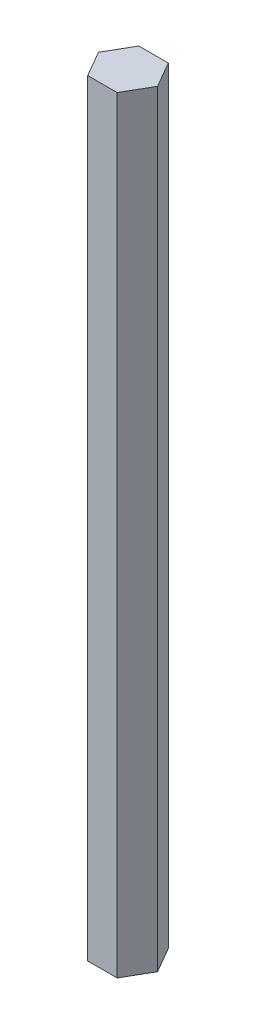
ISO-10303-21;
HEADER;
FILE_DESCRIPTION(('STEP AP214'),'2;1');
FILE_NAME('part.step','',(''),(''),'','','');
FILE_SCHEMA(('AUTOMOTIVE_DESIGN { 1 0 10303 214 1 1 1 1 }'));
ENDSEC;
DATA;
#1=APPLICATION_CONTEXT('core data for automotive mechanical design processes');
#2=APPLICATION_PROTOCOL_DEFINITION('international standard','automotive_design',2000,#1);
#3=PRODUCT_CONTEXT('',#1,'mechanical');
#4=PRODUCT('Part','Part','',(#3));
#5=PRODUCT_RELATED_PRODUCT_CATEGORY('part','',(#4));
#6=PRODUCT_DEFINITION_FORMATION('','',#4);
#7=PRODUCT_DEFINITION_CONTEXT('part definition',#1,'design');
#8=PRODUCT_DEFINITION('design','',#6,#7);
#9=PRODUCT_DEFINITION_SHAPE('','',#8);
#10=(LENGTH_UNIT() NAMED_UNIT(*) SI_UNIT(.MILLI.,.METRE.));
#11=(NAMED_UNIT(*) PLANE_ANGLE_UNIT() SI_UNIT($,.RADIAN.));
#12=(NAMED_UNIT(*) SI_UNIT($,.STERADIAN.) SOLID_ANGLE_UNIT());
#13=UNCERTAINTY_MEASURE_WITH_UNIT(LENGTH_MEASURE(1.E-05),#10,'distance_accuracy_value','');
#14=(GEOMETRIC_REPRESENTATION_CONTEXT(3) GLOBAL_UNCERTAINTY_ASSIGNED_CONTEXT((#13)) GLOBAL_UNIT_ASSIGNED_CONTEXT((#10,
#11,#12)) REPRESENTATION_CONTEXT('',''));
#15=CARTESIAN_POINT('',(0.,0.,0.));
#16=DIRECTION('',(0.,0.,1.));
#17=DIRECTION('',(1.,0.,0.));
#18=AXIS2_PLACEMENT_3D('',#15,#16,#17);
#19=CARTESIAN_POINT('',(-1.44337567297406,75.,2.5));
#20=DIRECTION('',(0.,0.,-1.));
#21=DIRECTION('',(-1.,0.,0.));
#22=AXIS2_PLACEMENT_3D('',#19,#20,#21);
#23=PLANE('',#22);
#24=DIRECTION('',(1.,0.,0.));
#25=VECTOR('',#24,1.);
#26=CARTESIAN_POINT('',(-1.44337567297406,0.,2.5));
#27=LINE('',#26,#25);
#28=CARTESIAN_POINT('',(-1.44337567297406,0.,2.5));
#29=VERTEX_POINT('',#28);
#30=CARTESIAN_POINT('',(1.44337567297406,0.,2.5));
#31=VERTEX_POINT('',#30);
#32=EDGE_CURVE('E116',#29,#31,#27,.T.);
#33=ORIENTED_EDGE('',*,*,#32,.T.);
#34=DIRECTION('',(0.,-1.,0.));
#35=VECTOR('',#34,1.);
#36=CARTESIAN_POINT('',(1.44337567297406,75.,2.5));
#37=LINE('',#36,#35);
#38=CARTESIAN_POINT('',(1.44337567297406,75.,2.5));
#39=VERTEX_POINT('',#38);
#40=EDGE_CURVE('E11',#39,#31,#37,.T.);
#41=ORIENTED_EDGE('',*,*,#40,.F.);
#42=DIRECTION('',(1.,0.,0.));
#43=VECTOR('',#42,1.);
#44=CARTESIAN_POINT('',(-1.44337567297406,75.,2.5));
#45=LINE('',#44,#43);
#46=CARTESIAN_POINT('',(-1.44337567297406,75.,2.5));
#47=VERTEX_POINT('',#46);
#48=EDGE_CURVE('E126',#47,#39,#45,.T.);
#49=ORIENTED_EDGE('',*,*,#48,.F.);
#50=DIRECTION('',(0.,-1.,0.));
#51=VECTOR('',#50,1.);
#52=CARTESIAN_POINT('',(-1.44337567297406,75.,2.5));
#53=LINE('',#52,#51);
#54=EDGE_CURVE('E112',#47,#29,#53,.T.);
#55=ORIENTED_EDGE('',*,*,#54,.T.);
#56=EDGE_LOOP('',(#33,#41,#49,#55));
#57=FACE_BOUND('',#56,.T.);
#58=ADVANCED_FACE('F32',(#57),#23,.F.);
#59=CARTESIAN_POINT('',(1.44337567297406,75.,2.5));
#60=DIRECTION('',(-0.866025403784438,0.,-0.5));
#61=DIRECTION('',(-0.5,0.,0.866025403784439));
#62=AXIS2_PLACEMENT_3D('',#59,#60,#61);
#63=PLANE('',#62);
#64=DIRECTION('',(0.5,0.,-0.866025403784438));
#65=VECTOR('',#64,1.);
#66=CARTESIAN_POINT('',(1.44337567297406,0.,2.5));
#67=LINE('',#66,#65);
#68=CARTESIAN_POINT('',(2.88675134594813,0.,0.));
#69=VERTEX_POINT('',#68);
#70=EDGE_CURVE('E119',#31,#69,#67,.T.);
#71=ORIENTED_EDGE('',*,*,#70,.T.);
#72=DIRECTION('',(0.,-1.,0.));
#73=VECTOR('',#72,1.);
#74=CARTESIAN_POINT('',(2.88675134594813,75.,0.));
#75=LINE('',#74,#73);
#76=CARTESIAN_POINT('',(2.88675134594813,75.,0.));
#77=VERTEX_POINT('',#76);
#78=EDGE_CURVE('E40',#77,#69,#75,.T.);
#79=ORIENTED_EDGE('',*,*,#78,.F.);
#80=DIRECTION('',(0.5,0.,-0.866025403784438));
#81=VECTOR('',#80,1.);
#82=CARTESIAN_POINT('',(1.44337567297406,75.,2.5));
#83=LINE('',#82,#81);
#84=EDGE_CURVE('E85',#39,#77,#83,.T.);
#85=ORIENTED_EDGE('',*,*,#84,.F.);
#86=ORIENTED_EDGE('',*,*,#40,.T.);
#87=EDGE_LOOP('',(#71,#79,#85,#86));
#88=FACE_BOUND('',#87,.T.);
#89=ADVANCED_FACE('F150',(#88),#63,.F.);
#90=CARTESIAN_POINT('',(2.88675134594813,75.,0.));
#91=DIRECTION('',(-0.866025403784438,0.,0.5));
#92=DIRECTION('',(0.5,0.,0.866025403784439));
#93=AXIS2_PLACEMENT_3D('',#90,#91,#92);
#94=PLANE('',#93);
#95=DIRECTION('',(-0.5,0.,-0.866025403784438));
#96=VECTOR('',#95,1.);
#97=CARTESIAN_POINT('',(2.88675134594813,0.,0.));
#98=LINE('',#97,#96);
#99=CARTESIAN_POINT('',(1.44337567297406,0.,-2.5));
#100=VERTEX_POINT('',#99);
#101=EDGE_CURVE('E121',#69,#100,#98,.T.);
#102=ORIENTED_EDGE('',*,*,#101,.T.);
#103=DIRECTION('',(0.,-1.,0.));
#104=VECTOR('',#103,1.);
#105=CARTESIAN_POINT('',(1.44337567297406,75.,-2.5));
#106=LINE('',#105,#104);
#107=CARTESIAN_POINT('',(1.44337567297406,75.,-2.5));
#108=VERTEX_POINT('',#107);
#109=EDGE_CURVE('E107',#108,#100,#106,.T.);
#110=ORIENTED_EDGE('',*,*,#109,.F.);
#111=DIRECTION('',(-0.5,0.,-0.866025403784438));
#112=VECTOR('',#111,1.);
#113=CARTESIAN_POINT('',(2.88675134594813,75.,0.));
#114=LINE('',#113,#112);
#115=EDGE_CURVE('E98',#77,#108,#114,.T.);
#116=ORIENTED_EDGE('',*,*,#115,.F.);
#117=ORIENTED_EDGE('',*,*,#78,.T.);
#118=EDGE_LOOP('',(#102,#110,#116,#117));
#119=FACE_BOUND('',#118,.T.);
#120=ADVANCED_FACE('F132',(#119),#94,.F.);
#121=CARTESIAN_POINT('',(1.44337567297406,75.,-2.5));
#122=DIRECTION('',(0.,0.,1.));
#123=DIRECTION('',(1.,0.,0.));
#124=AXIS2_PLACEMENT_3D('',#121,#122,#123);
#125=PLANE('',#124);
#126=DIRECTION('',(-1.,0.,0.));
#127=VECTOR('',#126,1.);
#128=CARTESIAN_POINT('',(1.44337567297406,0.,-2.5));
#129=LINE('',#128,#127);
#130=CARTESIAN_POINT('',(-1.44337567297406,0.,-2.5));
#131=VERTEX_POINT('',#130);
#132=EDGE_CURVE('E106',#100,#131,#129,.T.);
#133=ORIENTED_EDGE('',*,*,#132,.T.);
#134=DIRECTION('',(0.,-1.,0.));
#135=VECTOR('',#134,1.);
#136=CARTESIAN_POINT('',(-1.44337567297406,75.,-2.5));
#137=LINE('',#136,#135);
#138=CARTESIAN_POINT('',(-1.44337567297406,75.,-2.5));
#139=VERTEX_POINT('',#138);
#140=EDGE_CURVE('E103',#139,#131,#137,.T.);
#141=ORIENTED_EDGE('',*,*,#140,.F.);
#142=DIRECTION('',(-1.,0.,0.));
#143=VECTOR('',#142,1.);
#144=CARTESIAN_POINT('',(1.44337567297406,75.,-2.5));
#145=LINE('',#144,#143);
#146=EDGE_CURVE('E92',#108,#139,#145,.T.);
#147=ORIENTED_EDGE('',*,*,#146,.F.);
#148=ORIENTED_EDGE('',*,*,#109,.T.);
#149=EDGE_LOOP('',(#133,#141,#147,#148));
#150=FACE_BOUND('',#149,.T.);
#151=ADVANCED_FACE('F104',(#150),#125,.F.);
#152=CARTESIAN_POINT('',(-1.44337567297406,75.,-2.5));
#153=DIRECTION('',(0.866025403784439,0.,0.5));
#154=DIRECTION('',(0.5,0.,-0.866025403784439));
#155=AXIS2_PLACEMENT_3D('',#152,#153,#154);
#156=PLANE('',#155);
#157=DIRECTION('',(-0.5,0.,0.866025403784439));
#158=VECTOR('',#157,1.);
#159=CARTESIAN_POINT('',(-1.44337567297406,0.,-2.5));
#160=LINE('',#159,#158);
#161=CARTESIAN_POINT('',(-2.88675134594813,0.,0.));
#162=VERTEX_POINT('',#161);
#163=EDGE_CURVE('E71',#131,#162,#160,.T.);
#164=ORIENTED_EDGE('',*,*,#163,.T.);
#165=DIRECTION('',(0.,-1.,0.));
#166=VECTOR('',#165,1.);
#167=CARTESIAN_POINT('',(-2.88675134594813,75.,0.));
#168=LINE('',#167,#166);
#169=CARTESIAN_POINT('',(-2.88675134594813,75.,0.));
#170=VERTEX_POINT('',#169);
#171=EDGE_CURVE('E108',#170,#162,#168,.T.);
#172=ORIENTED_EDGE('',*,*,#171,.F.);
#173=DIRECTION('',(-0.5,0.,0.866025403784439));
#174=VECTOR('',#173,1.);
#175=CARTESIAN_POINT('',(-1.44337567297406,75.,-2.5));
#176=LINE('',#175,#174);
#177=EDGE_CURVE('E96',#139,#170,#176,.T.);
#178=ORIENTED_EDGE('',*,*,#177,.F.);
#179=ORIENTED_EDGE('',*,*,#140,.T.);
#180=EDGE_LOOP('',(#164,#172,#178,#179));
#181=FACE_BOUND('',#180,.T.);
#182=ADVANCED_FACE('F110',(#181),#156,.F.);
#183=CARTESIAN_POINT('',(-2.88675134594813,75.,0.));
#184=DIRECTION('',(0.866025403784438,0.,-0.5));
#185=DIRECTION('',(-0.5,0.,-0.866025403784439));
#186=AXIS2_PLACEMENT_3D('',#183,#184,#185);
#187=PLANE('',#186);
#188=DIRECTION('',(0.5,0.,0.866025403784439));
#189=VECTOR('',#188,1.);
#190=CARTESIAN_POINT('',(-2.88675134594813,0.,0.));
#191=LINE('',#190,#189);
#192=EDGE_CURVE('E77',#162,#29,#191,.T.);
#193=ORIENTED_EDGE('',*,*,#192,.T.);
#194=ORIENTED_EDGE('',*,*,#54,.F.);
#195=DIRECTION('',(0.5,0.,0.866025403784439));
#196=VECTOR('',#195,1.);
#197=CARTESIAN_POINT('',(-2.88675134594813,75.,0.));
#198=LINE('',#197,#196);
#199=EDGE_CURVE('E48',#170,#47,#198,.T.);
#200=ORIENTED_EDGE('',*,*,#199,.F.);
#201=ORIENTED_EDGE('',*,*,#171,.T.);
#202=EDGE_LOOP('',(#193,#194,#200,#201));
#203=FACE_BOUND('',#202,.T.);
#204=ADVANCED_FACE('F139',(#203),#187,.F.);
#205=CARTESIAN_POINT('',(0.,75.,0.));
#206=DIRECTION('',(0.,1.,0.));
#207=DIRECTION('',(0.,0.,1.));
#208=AXIS2_PLACEMENT_3D('',#205,#206,#207);
#209=PLANE('',#208);
#210=ORIENTED_EDGE('',*,*,#48,.T.);
#211=ORIENTED_EDGE('',*,*,#84,.T.);
#212=ORIENTED_EDGE('',*,*,#115,.T.);
#213=ORIENTED_EDGE('',*,*,#146,.T.);
#214=ORIENTED_EDGE('',*,*,#177,.T.);
#215=ORIENTED_EDGE('',*,*,#199,.T.);
#216=EDGE_LOOP('',(#210,#211,#212,#213,#214,#215));
#217=FACE_BOUND('',#216,.T.);
#218=ADVANCED_FACE('F94',(#217),#209,.T.);
#219=CARTESIAN_POINT('',(0.,0.,0.));
#220=DIRECTION('',(0.,1.,0.));
#221=DIRECTION('',(0.,0.,1.));
#222=AXIS2_PLACEMENT_3D('',#219,#220,#221);
#223=PLANE('',#222);
#224=ORIENTED_EDGE('',*,*,#32,.F.);
#225=ORIENTED_EDGE('',*,*,#192,.F.);
#226=ORIENTED_EDGE('',*,*,#163,.F.);
#227=ORIENTED_EDGE('',*,*,#132,.F.);
#228=ORIENTED_EDGE('',*,*,#101,.F.);
#229=ORIENTED_EDGE('',*,*,#70,.F.);
#230=EDGE_LOOP('',(#224,#225,#226,#227,#228,#229));
#231=FACE_BOUND('',#230,.T.);
#232=ADVANCED_FACE('F135',(#231),#223,.F.);
#233=CLOSED_SHELL('',(#58,#89,#120,#151,#182,#204,#218,#232));
#234=MANIFOLD_SOLID_BREP('B2',#233);
#235=ADVANCED_BREP_SHAPE_REPRESENTATION('',(#18,#234),#14);
#236=SHAPE_DEFINITION_REPRESENTATION(#9,#235);
ENDSEC;
END-ISO-10303-21;
